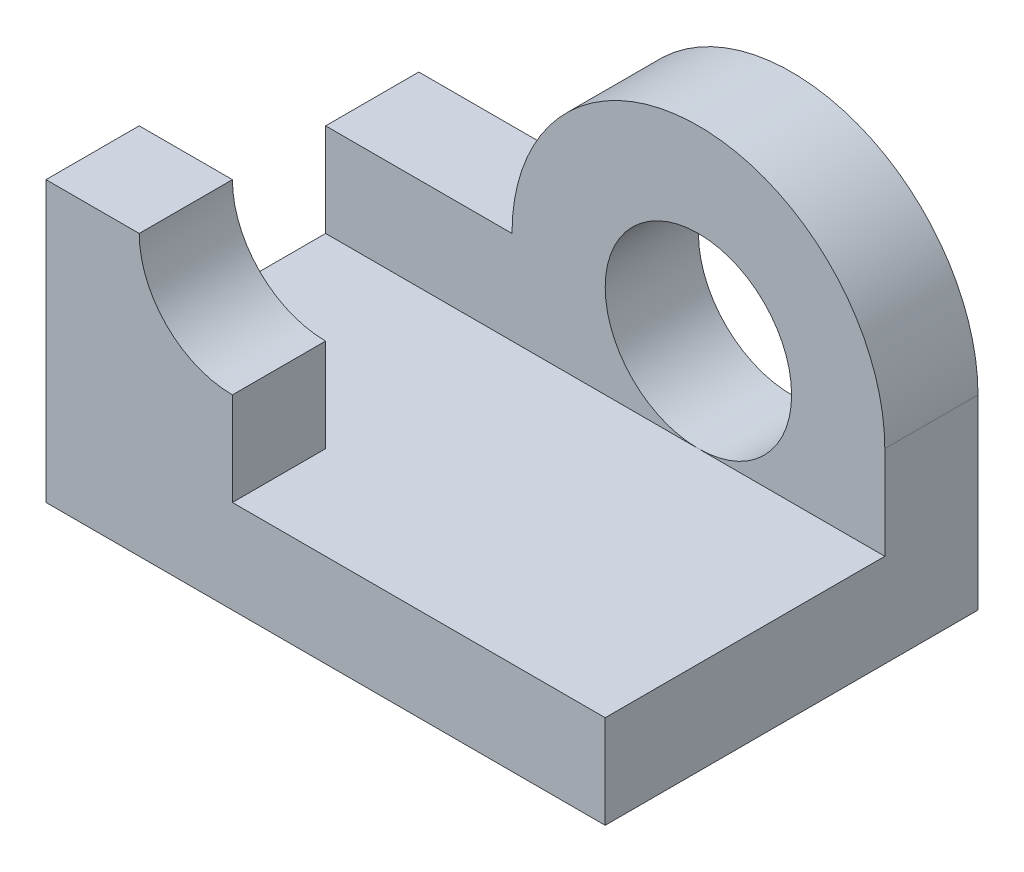
ISO-10303-21;
HEADER;
FILE_DESCRIPTION(('STEP AP214'),'2;1');
FILE_NAME('part.step','',(''),(''),'','','');
FILE_SCHEMA(('AUTOMOTIVE_DESIGN { 1 0 10303 214 1 1 1 1 }'));
ENDSEC;
DATA;
#1=APPLICATION_CONTEXT('core data for automotive mechanical design processes');
#2=APPLICATION_PROTOCOL_DEFINITION('international standard','automotive_design',2000,#1);
#3=PRODUCT_CONTEXT('',#1,'mechanical');
#4=PRODUCT('Part','Part','',(#3));
#5=PRODUCT_RELATED_PRODUCT_CATEGORY('part','',(#4));
#6=PRODUCT_DEFINITION_FORMATION('','',#4);
#7=PRODUCT_DEFINITION_CONTEXT('part definition',#1,'design');
#8=PRODUCT_DEFINITION('design','',#6,#7);
#9=PRODUCT_DEFINITION_SHAPE('','',#8);
#10=(LENGTH_UNIT() NAMED_UNIT(*) SI_UNIT(.MILLI.,.METRE.));
#11=(NAMED_UNIT(*) PLANE_ANGLE_UNIT() SI_UNIT($,.RADIAN.));
#12=(NAMED_UNIT(*) SI_UNIT($,.STERADIAN.) SOLID_ANGLE_UNIT());
#13=UNCERTAINTY_MEASURE_WITH_UNIT(LENGTH_MEASURE(1.E-05),#10,'distance_accuracy_value','');
#14=(GEOMETRIC_REPRESENTATION_CONTEXT(3) GLOBAL_UNCERTAINTY_ASSIGNED_CONTEXT((#13)) GLOBAL_UNIT_ASSIGNED_CONTEXT((#10,
#11,#12)) REPRESENTATION_CONTEXT('',''));
#15=CARTESIAN_POINT('',(0.,0.,0.));
#16=DIRECTION('',(0.,0.,1.));
#17=DIRECTION('',(1.,0.,0.));
#18=AXIS2_PLACEMENT_3D('',#15,#16,#17);
#19=CARTESIAN_POINT('',(0.,0.,0.));
#20=DIRECTION('',(0.,-1.,0.));
#21=DIRECTION('',(0.,0.,-1.));
#22=AXIS2_PLACEMENT_3D('',#19,#20,#21);
#23=PLANE('',#22);
#24=DIRECTION('',(1.,0.,0.));
#25=VECTOR('',#24,1.);
#26=CARTESIAN_POINT('',(0.,0.,-30.));
#27=LINE('',#26,#25);
#28=CARTESIAN_POINT('',(40.,0.,-30.));
#29=VERTEX_POINT('',#28);
#30=CARTESIAN_POINT('',(60.,0.,-30.));
#31=VERTEX_POINT('',#30);
#32=EDGE_CURVE('E157',#29,#31,#27,.T.);
#33=ORIENTED_EDGE('',*,*,#32,.F.);
#34=DIRECTION('',(1.,0.,0.));
#35=VECTOR('',#34,1.);
#36=CARTESIAN_POINT('',(0.,0.,-30.));
#37=LINE('',#36,#35);
#38=CARTESIAN_POINT('',(0.,0.,-30.));
#39=VERTEX_POINT('',#38);
#40=EDGE_CURVE('E179',#39,#29,#37,.T.);
#41=ORIENTED_EDGE('',*,*,#40,.F.);
#42=DIRECTION('',(0.,0.,1.));
#43=VECTOR('',#42,1.);
#44=CARTESIAN_POINT('',(0.,0.,0.));
#45=LINE('',#44,#43);
#46=CARTESIAN_POINT('',(0.,0.,-10.));
#47=VERTEX_POINT('',#46);
#48=EDGE_CURVE('E214',#39,#47,#45,.T.);
#49=ORIENTED_EDGE('',*,*,#48,.T.);
#50=DIRECTION('',(1.,0.,0.));
#51=VECTOR('',#50,1.);
#52=CARTESIAN_POINT('',(20.,0.,-10.));
#53=LINE('',#52,#51);
#54=CARTESIAN_POINT('',(20.,0.,-10.));
#55=VERTEX_POINT('',#54);
#56=EDGE_CURVE('E187',#47,#55,#53,.T.);
#57=ORIENTED_EDGE('',*,*,#56,.T.);
#58=DIRECTION('',(0.,0.,1.));
#59=VECTOR('',#58,1.);
#60=CARTESIAN_POINT('',(20.,0.,-10.));
#61=LINE('',#60,#59);
#62=CARTESIAN_POINT('',(20.,0.,0.));
#63=VERTEX_POINT('',#62);
#64=EDGE_CURVE('E203',#55,#63,#61,.T.);
#65=ORIENTED_EDGE('',*,*,#64,.T.);
#66=DIRECTION('',(1.,0.,0.));
#67=VECTOR('',#66,1.);
#68=CARTESIAN_POINT('',(0.,0.,0.));
#69=LINE('',#68,#67);
#70=CARTESIAN_POINT('',(60.,0.,0.));
#71=VERTEX_POINT('',#70);
#72=EDGE_CURVE('E234',#63,#71,#69,.T.);
#73=ORIENTED_EDGE('',*,*,#72,.T.);
#74=DIRECTION('',(0.,0.,-1.));
#75=VECTOR('',#74,1.);
#76=CARTESIAN_POINT('',(60.,0.,0.));
#77=LINE('',#76,#75);
#78=EDGE_CURVE('E225',#71,#31,#77,.T.);
#79=ORIENTED_EDGE('',*,*,#78,.T.);
#80=EDGE_LOOP('',(#33,#41,#49,#57,#65,#73,#79));
#81=FACE_BOUND('',#80,.T.);
#82=ADVANCED_FACE('F57',(#81),#23,.F.);
#83=CARTESIAN_POINT('',(0.,-10.,0.));
#84=DIRECTION('',(-1.,0.,0.));
#85=DIRECTION('',(0.,0.,1.));
#86=AXIS2_PLACEMENT_3D('',#83,#84,#85);
#87=PLANE('',#86);
#88=ORIENTED_EDGE('',*,*,#48,.F.);
#89=DIRECTION('',(0.,-1.,0.));
#90=VECTOR('',#89,1.);
#91=CARTESIAN_POINT('',(0.,0.,-30.));
#92=LINE('',#91,#90);
#93=CARTESIAN_POINT('',(0.,10.,-30.));
#94=VERTEX_POINT('',#93);
#95=EDGE_CURVE('E176',#94,#39,#92,.T.);
#96=ORIENTED_EDGE('',*,*,#95,.F.);
#97=DIRECTION('',(0.,0.,-1.));
#98=VECTOR('',#97,1.);
#99=CARTESIAN_POINT('',(0.,10.,-30.));
#100=LINE('',#99,#98);
#101=CARTESIAN_POINT('',(0.,10.,-40.));
#102=VERTEX_POINT('',#101);
#103=EDGE_CURVE('E182',#94,#102,#100,.T.);
#104=ORIENTED_EDGE('',*,*,#103,.T.);
#105=DIRECTION('',(0.,1.,0.));
#106=VECTOR('',#105,1.);
#107=CARTESIAN_POINT('',(0.,-10.,-40.));
#108=LINE('',#107,#106);
#109=CARTESIAN_POINT('',(0.,-10.,-40.));
#110=VERTEX_POINT('',#109);
#111=EDGE_CURVE('E12',#110,#102,#108,.T.);
#112=ORIENTED_EDGE('',*,*,#111,.F.);
#113=DIRECTION('',(0.,0.,1.));
#114=VECTOR('',#113,1.);
#115=CARTESIAN_POINT('',(0.,-10.,0.));
#116=LINE('',#115,#114);
#117=CARTESIAN_POINT('',(0.,-10.,0.));
#118=VERTEX_POINT('',#117);
#119=EDGE_CURVE('E221',#110,#118,#116,.T.);
#120=ORIENTED_EDGE('',*,*,#119,.T.);
#121=DIRECTION('',(0.,1.,0.));
#122=VECTOR('',#121,1.);
#123=CARTESIAN_POINT('',(0.,-10.,0.));
#124=LINE('',#123,#122);
#125=CARTESIAN_POINT('',(0.,20.,0.));
#126=VERTEX_POINT('',#125);
#127=EDGE_CURVE('E61',#118,#126,#124,.T.);
#128=ORIENTED_EDGE('',*,*,#127,.T.);
#129=DIRECTION('',(0.,0.,1.));
#130=VECTOR('',#129,1.);
#131=CARTESIAN_POINT('',(0.,20.,-10.));
#132=LINE('',#131,#130);
#133=CARTESIAN_POINT('',(0.,20.,-10.));
#134=VERTEX_POINT('',#133);
#135=EDGE_CURVE('E211',#134,#126,#132,.T.);
#136=ORIENTED_EDGE('',*,*,#135,.F.);
#137=DIRECTION('',(0.,-1.,0.));
#138=VECTOR('',#137,1.);
#139=CARTESIAN_POINT('',(0.,0.,-10.));
#140=LINE('',#139,#138);
#141=EDGE_CURVE('E200',#134,#47,#140,.T.);
#142=ORIENTED_EDGE('',*,*,#141,.T.);
#143=EDGE_LOOP('',(#88,#96,#104,#112,#120,#128,#136,#142));
#144=FACE_BOUND('',#143,.T.);
#145=ADVANCED_FACE('F59',(#144),#87,.T.);
#146=CARTESIAN_POINT('',(0.,-10.,-40.));
#147=DIRECTION('',(0.,0.,-1.));
#148=DIRECTION('',(-1.,0.,0.));
#149=AXIS2_PLACEMENT_3D('',#146,#147,#148);
#150=PLANE('',#149);
#151=DIRECTION('',(-1.,0.,0.));
#152=VECTOR('',#151,1.);
#153=CARTESIAN_POINT('',(0.,10.,-40.));
#154=LINE('',#153,#152);
#155=CARTESIAN_POINT('',(20.,10.,-40.));
#156=VERTEX_POINT('',#155);
#157=EDGE_CURVE('E173',#156,#102,#154,.T.);
#158=ORIENTED_EDGE('',*,*,#157,.F.);
#159=CARTESIAN_POINT('',(40.,10.,-40.));
#160=DIRECTION('',(0.,0.,-1.));
#161=DIRECTION('',(-1.,0.,0.));
#162=AXIS2_PLACEMENT_3D('',#159,#160,#161);
#163=CIRCLE('',#162,20.);
#164=CARTESIAN_POINT('',(60.,10.,-40.));
#165=VERTEX_POINT('',#164);
#166=EDGE_CURVE('E150',#156,#165,#163,.T.);
#167=ORIENTED_EDGE('',*,*,#166,.T.);
#168=DIRECTION('',(0.,1.,0.));
#169=VECTOR('',#168,1.);
#170=CARTESIAN_POINT('',(60.,-10.,-40.));
#171=LINE('',#170,#169);
#172=CARTESIAN_POINT('',(60.,-10.,-40.));
#173=VERTEX_POINT('',#172);
#174=EDGE_CURVE('E66',#173,#165,#171,.T.);
#175=ORIENTED_EDGE('',*,*,#174,.F.);
#176=DIRECTION('',(-1.,0.,0.));
#177=VECTOR('',#176,1.);
#178=CARTESIAN_POINT('',(0.,-10.,-40.));
#179=LINE('',#178,#177);
#180=EDGE_CURVE('E230',#173,#110,#179,.T.);
#181=ORIENTED_EDGE('',*,*,#180,.T.);
#182=ORIENTED_EDGE('',*,*,#111,.T.);
#183=EDGE_LOOP('',(#158,#167,#175,#181,#182));
#184=FACE_BOUND('',#183,.T.);
#185=CARTESIAN_POINT('',(40.,10.,-40.));
#186=DIRECTION('',(0.,0.,-1.));
#187=DIRECTION('',(-1.,0.,0.));
#188=AXIS2_PLACEMENT_3D('',#185,#186,#187);
#189=CIRCLE('',#188,10.);
#190=CARTESIAN_POINT('',(30.,10.,-40.));
#191=VERTEX_POINT('',#190);
#192=EDGE_CURVE('E161',#191,#191,#189,.T.);
#193=ORIENTED_EDGE('',*,*,#192,.F.);
#194=EDGE_LOOP('',(#193));
#195=FACE_BOUND('',#194,.T.);
#196=ADVANCED_FACE('F268',(#184,#195),#150,.T.);
#197=CARTESIAN_POINT('',(60.,-10.,0.));
#198=DIRECTION('',(1.,0.,0.));
#199=DIRECTION('',(0.,0.,-1.));
#200=AXIS2_PLACEMENT_3D('',#197,#198,#199);
#201=PLANE('',#200);
#202=ORIENTED_EDGE('',*,*,#78,.F.);
#203=DIRECTION('',(0.,1.,0.));
#204=VECTOR('',#203,1.);
#205=CARTESIAN_POINT('',(60.,-10.,0.));
#206=LINE('',#205,#204);
#207=CARTESIAN_POINT('',(60.,-10.,0.));
#208=VERTEX_POINT('',#207);
#209=EDGE_CURVE('E237',#208,#71,#206,.T.);
#210=ORIENTED_EDGE('',*,*,#209,.F.);
#211=DIRECTION('',(0.,0.,-1.));
#212=VECTOR('',#211,1.);
#213=CARTESIAN_POINT('',(60.,-10.,0.));
#214=LINE('',#213,#212);
#215=EDGE_CURVE('E228',#208,#173,#214,.T.);
#216=ORIENTED_EDGE('',*,*,#215,.T.);
#217=ORIENTED_EDGE('',*,*,#174,.T.);
#218=DIRECTION('',(0.,0.,-1.));
#219=VECTOR('',#218,1.);
#220=CARTESIAN_POINT('',(60.,10.,-30.));
#221=LINE('',#220,#219);
#222=CARTESIAN_POINT('',(60.,10.,-30.));
#223=VERTEX_POINT('',#222);
#224=EDGE_CURVE('E147',#223,#165,#221,.T.);
#225=ORIENTED_EDGE('',*,*,#224,.F.);
#226=DIRECTION('',(0.,1.,0.));
#227=VECTOR('',#226,1.);
#228=CARTESIAN_POINT('',(60.,0.,-30.));
#229=LINE('',#228,#227);
#230=EDGE_CURVE('E153',#31,#223,#229,.T.);
#231=ORIENTED_EDGE('',*,*,#230,.F.);
#232=EDGE_LOOP('',(#202,#210,#216,#217,#225,#231));
#233=FACE_BOUND('',#232,.T.);
#234=ADVANCED_FACE('F164',(#233),#201,.T.);
#235=CARTESIAN_POINT('',(0.,-10.,0.));
#236=DIRECTION('',(0.,0.,1.));
#237=DIRECTION('',(1.,0.,0.));
#238=AXIS2_PLACEMENT_3D('',#235,#236,#237);
#239=PLANE('',#238);
#240=ORIENTED_EDGE('',*,*,#72,.F.);
#241=DIRECTION('',(0.,1.,0.));
#242=VECTOR('',#241,1.);
#243=CARTESIAN_POINT('',(20.,10.,0.));
#244=LINE('',#243,#242);
#245=CARTESIAN_POINT('',(20.,10.,0.));
#246=VERTEX_POINT('',#245);
#247=EDGE_CURVE('E186',#63,#246,#244,.T.);
#248=ORIENTED_EDGE('',*,*,#247,.T.);
#249=CARTESIAN_POINT('',(20.,20.,0.));
#250=DIRECTION('',(0.,0.,-1.));
#251=DIRECTION('',(1.,0.,0.));
#252=AXIS2_PLACEMENT_3D('',#249,#250,#251);
#253=CIRCLE('',#252,10.);
#254=CARTESIAN_POINT('',(10.,20.,0.));
#255=VERTEX_POINT('',#254);
#256=EDGE_CURVE('E206',#246,#255,#253,.T.);
#257=ORIENTED_EDGE('',*,*,#256,.T.);
#258=DIRECTION('',(-1.,0.,0.));
#259=VECTOR('',#258,1.);
#260=CARTESIAN_POINT('',(0.,20.,0.));
#261=LINE('',#260,#259);
#262=EDGE_CURVE('E191',#255,#126,#261,.T.);
#263=ORIENTED_EDGE('',*,*,#262,.T.);
#264=ORIENTED_EDGE('',*,*,#127,.F.);
#265=DIRECTION('',(1.,0.,0.));
#266=VECTOR('',#265,1.);
#267=CARTESIAN_POINT('',(0.,-10.,0.));
#268=LINE('',#267,#266);
#269=EDGE_CURVE('E224',#118,#208,#268,.T.);
#270=ORIENTED_EDGE('',*,*,#269,.T.);
#271=ORIENTED_EDGE('',*,*,#209,.T.);
#272=EDGE_LOOP('',(#240,#248,#257,#263,#264,#270,#271));
#273=FACE_BOUND('',#272,.T.);
#274=ADVANCED_FACE('F250',(#273),#239,.T.);
#275=CARTESIAN_POINT('',(0.,-10.,0.));
#276=DIRECTION('',(0.,-1.,0.));
#277=DIRECTION('',(0.,0.,-1.));
#278=AXIS2_PLACEMENT_3D('',#275,#276,#277);
#279=PLANE('',#278);
#280=ORIENTED_EDGE('',*,*,#119,.F.);
#281=ORIENTED_EDGE('',*,*,#180,.F.);
#282=ORIENTED_EDGE('',*,*,#215,.F.);
#283=ORIENTED_EDGE('',*,*,#269,.F.);
#284=EDGE_LOOP('',(#280,#281,#282,#283));
#285=FACE_BOUND('',#284,.T.);
#286=ADVANCED_FACE('F266',(#285),#279,.T.);
#287=CARTESIAN_POINT('',(0.,20.,-10.));
#288=DIRECTION('',(0.,1.,0.));
#289=DIRECTION('',(0.,0.,1.));
#290=AXIS2_PLACEMENT_3D('',#287,#288,#289);
#291=PLANE('',#290);
#292=ORIENTED_EDGE('',*,*,#262,.F.);
#293=DIRECTION('',(0.,0.,1.));
#294=VECTOR('',#293,1.);
#295=CARTESIAN_POINT('',(10.,20.,-10.));
#296=LINE('',#295,#294);
#297=CARTESIAN_POINT('',(10.,20.,-10.));
#298=VERTEX_POINT('',#297);
#299=EDGE_CURVE('E215',#298,#255,#296,.T.);
#300=ORIENTED_EDGE('',*,*,#299,.F.);
#301=DIRECTION('',(-1.,0.,0.));
#302=VECTOR('',#301,1.);
#303=CARTESIAN_POINT('',(0.,20.,-10.));
#304=LINE('',#303,#302);
#305=EDGE_CURVE('E197',#298,#134,#304,.T.);
#306=ORIENTED_EDGE('',*,*,#305,.T.);
#307=ORIENTED_EDGE('',*,*,#135,.T.);
#308=EDGE_LOOP('',(#292,#300,#306,#307));
#309=FACE_BOUND('',#308,.T.);
#310=ADVANCED_FACE('F247',(#309),#291,.T.);
#311=CARTESIAN_POINT('',(20.,20.,-10.));
#312=DIRECTION('',(0.,0.,1.));
#313=DIRECTION('',(1.,0.,0.));
#314=AXIS2_PLACEMENT_3D('',#311,#312,#313);
#315=CYLINDRICAL_SURFACE('',#314,10.);
#316=ORIENTED_EDGE('',*,*,#256,.F.);
#317=DIRECTION('',(0.,0.,1.));
#318=VECTOR('',#317,1.);
#319=CARTESIAN_POINT('',(20.,10.,-10.));
#320=LINE('',#319,#318);
#321=CARTESIAN_POINT('',(20.,10.,-10.));
#322=VERTEX_POINT('',#321);
#323=EDGE_CURVE('E217',#322,#246,#320,.T.);
#324=ORIENTED_EDGE('',*,*,#323,.F.);
#325=CARTESIAN_POINT('',(20.,20.,-10.));
#326=DIRECTION('',(0.,0.,-1.));
#327=DIRECTION('',(1.,0.,0.));
#328=AXIS2_PLACEMENT_3D('',#325,#326,#327);
#329=CIRCLE('',#328,10.);
#330=EDGE_CURVE('E194',#322,#298,#329,.T.);
#331=ORIENTED_EDGE('',*,*,#330,.T.);
#332=ORIENTED_EDGE('',*,*,#299,.T.);
#333=EDGE_LOOP('',(#316,#324,#331,#332));
#334=FACE_BOUND('',#333,.T.);
#335=ADVANCED_FACE('F253',(#334),#315,.F.);
#336=CARTESIAN_POINT('',(20.,10.,-10.));
#337=DIRECTION('',(1.,0.,0.));
#338=DIRECTION('',(0.,0.,-1.));
#339=AXIS2_PLACEMENT_3D('',#336,#337,#338);
#340=PLANE('',#339);
#341=ORIENTED_EDGE('',*,*,#247,.F.);
#342=ORIENTED_EDGE('',*,*,#64,.F.);
#343=DIRECTION('',(0.,1.,0.));
#344=VECTOR('',#343,1.);
#345=CARTESIAN_POINT('',(20.,10.,-10.));
#346=LINE('',#345,#344);
#347=EDGE_CURVE('E190',#55,#322,#346,.T.);
#348=ORIENTED_EDGE('',*,*,#347,.T.);
#349=ORIENTED_EDGE('',*,*,#323,.T.);
#350=EDGE_LOOP('',(#341,#342,#348,#349));
#351=FACE_BOUND('',#350,.T.);
#352=ADVANCED_FACE('F271',(#351),#340,.T.);
#353=CARTESIAN_POINT('',(20.,20.,-10.));
#354=DIRECTION('',(0.,0.,1.));
#355=DIRECTION('',(1.,0.,0.));
#356=AXIS2_PLACEMENT_3D('',#353,#354,#355);
#357=PLANE('',#356);
#358=ORIENTED_EDGE('',*,*,#56,.F.);
#359=ORIENTED_EDGE('',*,*,#141,.F.);
#360=ORIENTED_EDGE('',*,*,#305,.F.);
#361=ORIENTED_EDGE('',*,*,#330,.F.);
#362=ORIENTED_EDGE('',*,*,#347,.F.);
#363=EDGE_LOOP('',(#358,#359,#360,#361,#362));
#364=FACE_BOUND('',#363,.T.);
#365=ADVANCED_FACE('F257',(#364),#357,.F.);
#366=CARTESIAN_POINT('',(0.,10.,-30.));
#367=DIRECTION('',(0.,-1.,0.));
#368=DIRECTION('',(0.,0.,-1.));
#369=AXIS2_PLACEMENT_3D('',#366,#367,#368);
#370=PLANE('',#369);
#371=DIRECTION('',(-1.,0.,0.));
#372=VECTOR('',#371,1.);
#373=CARTESIAN_POINT('',(0.,10.,-30.));
#374=LINE('',#373,#372);
#375=CARTESIAN_POINT('',(20.,10.,-30.));
#376=VERTEX_POINT('',#375);
#377=EDGE_CURVE('E79',#376,#94,#374,.T.);
#378=ORIENTED_EDGE('',*,*,#377,.F.);
#379=DIRECTION('',(0.,0.,-1.));
#380=VECTOR('',#379,1.);
#381=CARTESIAN_POINT('',(20.,10.,-30.));
#382=LINE('',#381,#380);
#383=EDGE_CURVE('E74',#376,#156,#382,.T.);
#384=ORIENTED_EDGE('',*,*,#383,.T.);
#385=ORIENTED_EDGE('',*,*,#157,.T.);
#386=ORIENTED_EDGE('',*,*,#103,.F.);
#387=EDGE_LOOP('',(#378,#384,#385,#386));
#388=FACE_BOUND('',#387,.T.);
#389=ADVANCED_FACE('F262',(#388),#370,.F.);
#390=CARTESIAN_POINT('',(0.,0.,-30.));
#391=DIRECTION('',(0.,0.,-1.));
#392=DIRECTION('',(-1.,0.,0.));
#393=AXIS2_PLACEMENT_3D('',#390,#391,#392);
#394=PLANE('',#393);
#395=ORIENTED_EDGE('',*,*,#95,.T.);
#396=ORIENTED_EDGE('',*,*,#40,.T.);
#397=CARTESIAN_POINT('',(40.,10.,-30.));
#398=DIRECTION('',(0.,0.,-1.));
#399=DIRECTION('',(-1.,0.,0.));
#400=AXIS2_PLACEMENT_3D('',#397,#398,#399);
#401=CIRCLE('',#400,10.);
#402=EDGE_CURVE('E171',#29,#29,#401,.T.);
#403=ORIENTED_EDGE('',*,*,#402,.T.);
#404=ORIENTED_EDGE('',*,*,#32,.T.);
#405=ORIENTED_EDGE('',*,*,#230,.T.);
#406=CARTESIAN_POINT('',(40.,10.,-30.));
#407=DIRECTION('',(0.,0.,-1.));
#408=DIRECTION('',(-1.,0.,0.));
#409=AXIS2_PLACEMENT_3D('',#406,#407,#408);
#410=CIRCLE('',#409,20.);
#411=EDGE_CURVE('E142',#376,#223,#410,.T.);
#412=ORIENTED_EDGE('',*,*,#411,.F.);
#413=ORIENTED_EDGE('',*,*,#377,.T.);
#414=EDGE_LOOP('',(#395,#396,#403,#404,#405,#412,#413));
#415=FACE_BOUND('',#414,.T.);
#416=ADVANCED_FACE('F155',(#415),#394,.F.);
#417=CARTESIAN_POINT('',(40.,10.,-30.));
#418=DIRECTION('',(0.,0.,-1.));
#419=DIRECTION('',(-1.,0.,0.));
#420=AXIS2_PLACEMENT_3D('',#417,#418,#419);
#421=CYLINDRICAL_SURFACE('',#420,10.);
#422=ORIENTED_EDGE('',*,*,#192,.T.);
#423=EDGE_LOOP('',(#422));
#424=FACE_BOUND('',#423,.T.);
#425=ORIENTED_EDGE('',*,*,#402,.F.);
#426=EDGE_LOOP('',(#425));
#427=FACE_BOUND('',#426,.T.);
#428=ADVANCED_FACE('F305',(#424,#427),#421,.F.);
#429=CARTESIAN_POINT('',(40.,10.,-30.));
#430=DIRECTION('',(0.,0.,-1.));
#431=DIRECTION('',(-1.,0.,0.));
#432=AXIS2_PLACEMENT_3D('',#429,#430,#431);
#433=CYLINDRICAL_SURFACE('',#432,20.);
#434=ORIENTED_EDGE('',*,*,#166,.F.);
#435=ORIENTED_EDGE('',*,*,#383,.F.);
#436=ORIENTED_EDGE('',*,*,#411,.T.);
#437=ORIENTED_EDGE('',*,*,#224,.T.);
#438=EDGE_LOOP('',(#434,#435,#436,#437));
#439=FACE_BOUND('',#438,.T.);
#440=ADVANCED_FACE('F145',(#439),#433,.T.);
#441=CLOSED_SHELL('',(#82,#145,#196,#234,#274,#286,#310,#335,#352,#365,#389,#416,#428,#440));
#442=MANIFOLD_SOLID_BREP('B2',#441);
#443=ADVANCED_BREP_SHAPE_REPRESENTATION('',(#18,#442),#14);
#444=SHAPE_DEFINITION_REPRESENTATION(#9,#443);
ENDSEC;
END-ISO-10303-21;
